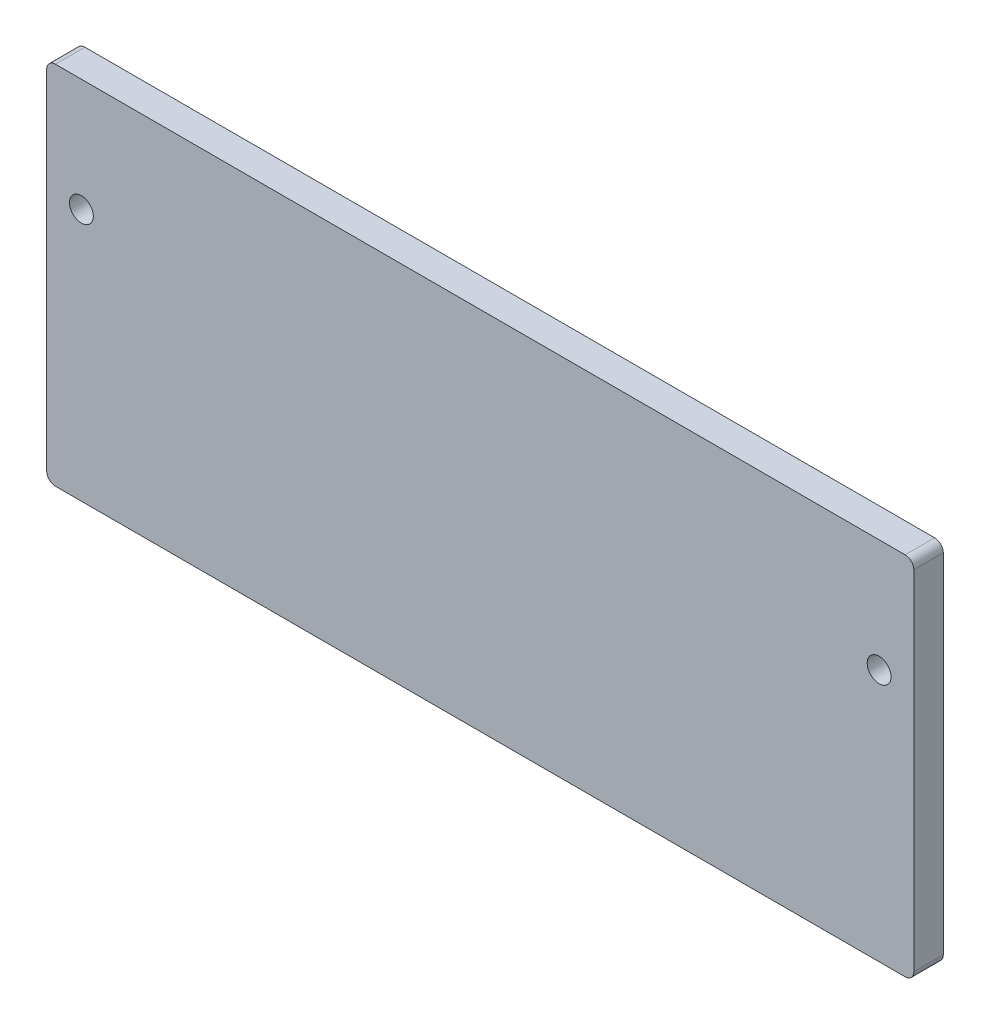
ISO-10303-21;
HEADER;
FILE_DESCRIPTION(('STEP AP214'),'2;1');
FILE_NAME('part.step','',(''),(''),'','','');
FILE_SCHEMA(('AUTOMOTIVE_DESIGN { 1 0 10303 214 1 1 1 1 }'));
ENDSEC;
DATA;
#1=APPLICATION_CONTEXT('core data for automotive mechanical design processes');
#2=APPLICATION_PROTOCOL_DEFINITION('international standard','automotive_design',2000,#1);
#3=PRODUCT_CONTEXT('',#1,'mechanical');
#4=PRODUCT('Part','Part','',(#3));
#5=PRODUCT_RELATED_PRODUCT_CATEGORY('part','',(#4));
#6=PRODUCT_DEFINITION_FORMATION('','',#4);
#7=PRODUCT_DEFINITION_CONTEXT('part definition',#1,'design');
#8=PRODUCT_DEFINITION('design','',#6,#7);
#9=PRODUCT_DEFINITION_SHAPE('','',#8);
#10=(LENGTH_UNIT() NAMED_UNIT(*) SI_UNIT(.MILLI.,.METRE.));
#11=(NAMED_UNIT(*) PLANE_ANGLE_UNIT() SI_UNIT($,.RADIAN.));
#12=(NAMED_UNIT(*) SI_UNIT($,.STERADIAN.) SOLID_ANGLE_UNIT());
#13=UNCERTAINTY_MEASURE_WITH_UNIT(LENGTH_MEASURE(1.E-05),#10,'distance_accuracy_value','');
#14=(GEOMETRIC_REPRESENTATION_CONTEXT(3) GLOBAL_UNCERTAINTY_ASSIGNED_CONTEXT((#13)) GLOBAL_UNIT_ASSIGNED_CONTEXT((#10,
#11,#12)) REPRESENTATION_CONTEXT('',''));
#15=CARTESIAN_POINT('',(0.,0.,0.));
#16=DIRECTION('',(0.,0.,1.));
#17=DIRECTION('',(1.,0.,0.));
#18=AXIS2_PLACEMENT_3D('',#15,#16,#17);
#19=CARTESIAN_POINT('',(-100.,-42.15,6.8));
#20=DIRECTION('',(1.,0.,0.));
#21=DIRECTION('',(0.,0.,-1.));
#22=AXIS2_PLACEMENT_3D('',#19,#20,#21);
#23=PLANE('',#22);
#24=DIRECTION('',(0.,-1.,0.));
#25=VECTOR('',#24,1.);
#26=CARTESIAN_POINT('',(-100.,-42.15,0.));
#27=LINE('',#26,#25);
#28=CARTESIAN_POINT('',(-100.,40.15,0.));
#29=VERTEX_POINT('',#28);
#30=CARTESIAN_POINT('',(-100.,-40.15,0.));
#31=VERTEX_POINT('',#30);
#32=EDGE_CURVE('E158',#29,#31,#27,.T.);
#33=ORIENTED_EDGE('',*,*,#32,.T.);
#34=DIRECTION('',(0.,0.,-1.));
#35=VECTOR('',#34,1.);
#36=CARTESIAN_POINT('',(-100.,-40.15,6.8));
#37=LINE('',#36,#35);
#38=CARTESIAN_POINT('',(-100.,-40.15,6.8));
#39=VERTEX_POINT('',#38);
#40=EDGE_CURVE('E11',#31,#39,#37,.F.);
#41=ORIENTED_EDGE('',*,*,#40,.T.);
#42=DIRECTION('',(0.,-1.,0.));
#43=VECTOR('',#42,1.);
#44=CARTESIAN_POINT('',(-100.,-42.15,6.8));
#45=LINE('',#44,#43);
#46=CARTESIAN_POINT('',(-100.,40.15,6.8));
#47=VERTEX_POINT('',#46);
#48=EDGE_CURVE('E126',#47,#39,#45,.T.);
#49=ORIENTED_EDGE('',*,*,#48,.F.);
#50=DIRECTION('',(0.,0.,-1.));
#51=VECTOR('',#50,1.);
#52=CARTESIAN_POINT('',(-100.,40.15,6.8));
#53=LINE('',#52,#51);
#54=EDGE_CURVE('E42',#47,#29,#53,.T.);
#55=ORIENTED_EDGE('',*,*,#54,.T.);
#56=EDGE_LOOP('',(#33,#41,#49,#55));
#57=FACE_BOUND('',#56,.T.);
#58=ADVANCED_FACE('F34',(#57),#23,.F.);
#59=CARTESIAN_POINT('',(100.,-42.15,6.8));
#60=DIRECTION('',(0.,1.,0.));
#61=DIRECTION('',(-1.,0.,0.));
#62=AXIS2_PLACEMENT_3D('',#59,#60,#61);
#63=PLANE('',#62);
#64=DIRECTION('',(1.,0.,0.));
#65=VECTOR('',#64,1.);
#66=CARTESIAN_POINT('',(100.,-42.15,0.));
#67=LINE('',#66,#65);
#68=CARTESIAN_POINT('',(-98.,-42.15,0.));
#69=VERTEX_POINT('',#68);
#70=CARTESIAN_POINT('',(98.,-42.15,0.));
#71=VERTEX_POINT('',#70);
#72=EDGE_CURVE('E131',#69,#71,#67,.T.);
#73=ORIENTED_EDGE('',*,*,#72,.T.);
#74=DIRECTION('',(0.,0.,-1.));
#75=VECTOR('',#74,1.);
#76=CARTESIAN_POINT('',(98.,-42.15,6.8));
#77=LINE('',#76,#75);
#78=CARTESIAN_POINT('',(98.,-42.15,6.8));
#79=VERTEX_POINT('',#78);
#80=EDGE_CURVE('E49',#71,#79,#77,.F.);
#81=ORIENTED_EDGE('',*,*,#80,.T.);
#82=DIRECTION('',(1.,0.,0.));
#83=VECTOR('',#82,1.);
#84=CARTESIAN_POINT('',(100.,-42.15,6.8));
#85=LINE('',#84,#83);
#86=CARTESIAN_POINT('',(-98.,-42.15,6.8));
#87=VERTEX_POINT('',#86);
#88=EDGE_CURVE('E129',#87,#79,#85,.T.);
#89=ORIENTED_EDGE('',*,*,#88,.F.);
#90=DIRECTION('',(0.,0.,-1.));
#91=VECTOR('',#90,1.);
#92=CARTESIAN_POINT('',(-98.,-42.15,6.8));
#93=LINE('',#92,#91);
#94=EDGE_CURVE('E150',#87,#69,#93,.T.);
#95=ORIENTED_EDGE('',*,*,#94,.T.);
#96=EDGE_LOOP('',(#73,#81,#89,#95));
#97=FACE_BOUND('',#96,.T.);
#98=ADVANCED_FACE('F204',(#97),#63,.F.);
#99=CARTESIAN_POINT('',(100.,-42.15,6.8));
#100=DIRECTION('',(-1.,0.,0.));
#101=DIRECTION('',(0.,0.,1.));
#102=AXIS2_PLACEMENT_3D('',#99,#100,#101);
#103=PLANE('',#102);
#104=DIRECTION('',(0.,1.,0.));
#105=VECTOR('',#104,1.);
#106=CARTESIAN_POINT('',(100.,-42.15,0.));
#107=LINE('',#106,#105);
#108=CARTESIAN_POINT('',(100.,-40.15,0.));
#109=VERTEX_POINT('',#108);
#110=CARTESIAN_POINT('',(100.,40.15,0.));
#111=VERTEX_POINT('',#110);
#112=EDGE_CURVE('E127',#109,#111,#107,.T.);
#113=ORIENTED_EDGE('',*,*,#112,.T.);
#114=DIRECTION('',(0.,0.,-1.));
#115=VECTOR('',#114,1.);
#116=CARTESIAN_POINT('',(100.,40.15,6.8));
#117=LINE('',#116,#115);
#118=CARTESIAN_POINT('',(100.,40.15,6.8));
#119=VERTEX_POINT('',#118);
#120=EDGE_CURVE('E105',#111,#119,#117,.F.);
#121=ORIENTED_EDGE('',*,*,#120,.T.);
#122=DIRECTION('',(0.,1.,0.));
#123=VECTOR('',#122,1.);
#124=CARTESIAN_POINT('',(100.,-42.15,6.8));
#125=LINE('',#124,#123);
#126=CARTESIAN_POINT('',(100.,-40.15,6.8));
#127=VERTEX_POINT('',#126);
#128=EDGE_CURVE('E170',#127,#119,#125,.T.);
#129=ORIENTED_EDGE('',*,*,#128,.F.);
#130=DIRECTION('',(0.,0.,-1.));
#131=VECTOR('',#130,1.);
#132=CARTESIAN_POINT('',(100.,-40.15,6.8));
#133=LINE('',#132,#131);
#134=EDGE_CURVE('E110',#127,#109,#133,.T.);
#135=ORIENTED_EDGE('',*,*,#134,.T.);
#136=EDGE_LOOP('',(#113,#121,#129,#135));
#137=FACE_BOUND('',#136,.T.);
#138=ADVANCED_FACE('F201',(#137),#103,.F.);
#139=CARTESIAN_POINT('',(100.,42.15,6.8));
#140=DIRECTION('',(0.,-1.,0.));
#141=DIRECTION('',(1.,0.,0.));
#142=AXIS2_PLACEMENT_3D('',#139,#140,#141);
#143=PLANE('',#142);
#144=DIRECTION('',(-1.,0.,0.));
#145=VECTOR('',#144,1.);
#146=CARTESIAN_POINT('',(100.,42.15,6.8));
#147=LINE('',#146,#145);
#148=CARTESIAN_POINT('',(98.,42.15,6.8));
#149=VERTEX_POINT('',#148);
#150=CARTESIAN_POINT('',(-98.,42.15,6.8));
#151=VERTEX_POINT('',#150);
#152=EDGE_CURVE('E120',#149,#151,#147,.T.);
#153=ORIENTED_EDGE('',*,*,#152,.F.);
#154=DIRECTION('',(0.,0.,-1.));
#155=VECTOR('',#154,1.);
#156=CARTESIAN_POINT('',(98.,42.15,6.8));
#157=LINE('',#156,#155);
#158=CARTESIAN_POINT('',(98.,42.15,0.));
#159=VERTEX_POINT('',#158);
#160=EDGE_CURVE('E104',#149,#159,#157,.T.);
#161=ORIENTED_EDGE('',*,*,#160,.T.);
#162=DIRECTION('',(-1.,0.,0.));
#163=VECTOR('',#162,1.);
#164=CARTESIAN_POINT('',(100.,42.15,0.));
#165=LINE('',#164,#163);
#166=CARTESIAN_POINT('',(-98.,42.15,0.));
#167=VERTEX_POINT('',#166);
#168=EDGE_CURVE('E117',#159,#167,#165,.T.);
#169=ORIENTED_EDGE('',*,*,#168,.T.);
#170=DIRECTION('',(0.,0.,-1.));
#171=VECTOR('',#170,1.);
#172=CARTESIAN_POINT('',(-98.,42.15,6.8));
#173=LINE('',#172,#171);
#174=EDGE_CURVE('E122',#167,#151,#173,.F.);
#175=ORIENTED_EDGE('',*,*,#174,.T.);
#176=EDGE_LOOP('',(#153,#161,#169,#175));
#177=FACE_BOUND('',#176,.T.);
#178=ADVANCED_FACE('F116',(#177),#143,.F.);
#179=CARTESIAN_POINT('',(0.,0.,6.8));
#180=DIRECTION('',(0.,0.,1.));
#181=DIRECTION('',(1.,0.,0.));
#182=AXIS2_PLACEMENT_3D('',#179,#180,#181);
#183=PLANE('',#182);
#184=CARTESIAN_POINT('',(92.,16.15,6.8));
#185=DIRECTION('',(0.,0.,1.));
#186=DIRECTION('',(1.,0.,0.));
#187=AXIS2_PLACEMENT_3D('',#184,#185,#186);
#188=CIRCLE('',#187,2.75000000000001);
#189=CARTESIAN_POINT('',(94.75,16.15,6.8));
#190=VERTEX_POINT('',#189);
#191=EDGE_CURVE('E177',#190,#190,#188,.T.);
#192=ORIENTED_EDGE('',*,*,#191,.F.);
#193=EDGE_LOOP('',(#192));
#194=FACE_BOUND('',#193,.T.);
#195=CARTESIAN_POINT('',(-92.,16.15,6.8));
#196=DIRECTION('',(0.,0.,1.));
#197=DIRECTION('',(1.,0.,0.));
#198=AXIS2_PLACEMENT_3D('',#195,#196,#197);
#199=CIRCLE('',#198,2.75000000000001);
#200=CARTESIAN_POINT('',(-89.25,16.15,6.8));
#201=VERTEX_POINT('',#200);
#202=EDGE_CURVE('E166',#201,#201,#199,.T.);
#203=ORIENTED_EDGE('',*,*,#202,.F.);
#204=EDGE_LOOP('',(#203));
#205=FACE_BOUND('',#204,.T.);
#206=ORIENTED_EDGE('',*,*,#128,.T.);
#207=CARTESIAN_POINT('',(98.,40.15,6.8));
#208=DIRECTION('',(0.,0.,1.));
#209=DIRECTION('',(1.,0.,0.));
#210=AXIS2_PLACEMENT_3D('',#207,#208,#209);
#211=CIRCLE('',#210,2.);
#212=EDGE_CURVE('E148',#119,#149,#211,.T.);
#213=ORIENTED_EDGE('',*,*,#212,.T.);
#214=ORIENTED_EDGE('',*,*,#152,.T.);
#215=CARTESIAN_POINT('',(-98.,40.15,6.8));
#216=DIRECTION('',(0.,0.,1.));
#217=DIRECTION('',(1.,0.,0.));
#218=AXIS2_PLACEMENT_3D('',#215,#216,#217);
#219=CIRCLE('',#218,2.);
#220=EDGE_CURVE('E143',#151,#47,#219,.T.);
#221=ORIENTED_EDGE('',*,*,#220,.T.);
#222=ORIENTED_EDGE('',*,*,#48,.T.);
#223=CARTESIAN_POINT('',(-98.,-40.15,6.8));
#224=DIRECTION('',(0.,0.,1.));
#225=DIRECTION('',(1.,0.,0.));
#226=AXIS2_PLACEMENT_3D('',#223,#224,#225);
#227=CIRCLE('',#226,2.);
#228=EDGE_CURVE('E56',#39,#87,#227,.T.);
#229=ORIENTED_EDGE('',*,*,#228,.T.);
#230=ORIENTED_EDGE('',*,*,#88,.T.);
#231=CARTESIAN_POINT('',(98.,-40.15,6.8));
#232=DIRECTION('',(0.,0.,1.));
#233=DIRECTION('',(1.,0.,0.));
#234=AXIS2_PLACEMENT_3D('',#231,#232,#233);
#235=CIRCLE('',#234,2.);
#236=EDGE_CURVE('E146',#79,#127,#235,.T.);
#237=ORIENTED_EDGE('',*,*,#236,.T.);
#238=EDGE_LOOP('',(#206,#213,#214,#221,#222,#229,#230,#237));
#239=FACE_BOUND('',#238,.T.);
#240=ADVANCED_FACE('F192',(#194,#205,#239),#183,.T.);
#241=CARTESIAN_POINT('',(0.,0.,0.));
#242=DIRECTION('',(0.,0.,1.));
#243=DIRECTION('',(1.,0.,0.));
#244=AXIS2_PLACEMENT_3D('',#241,#242,#243);
#245=PLANE('',#244);
#246=CARTESIAN_POINT('',(92.,16.15,0.));
#247=DIRECTION('',(0.,0.,1.));
#248=DIRECTION('',(1.,0.,0.));
#249=AXIS2_PLACEMENT_3D('',#246,#247,#248);
#250=CIRCLE('',#249,2.75000000000001);
#251=CARTESIAN_POINT('',(94.75,16.15,0.));
#252=VERTEX_POINT('',#251);
#253=EDGE_CURVE('E175',#252,#252,#250,.T.);
#254=ORIENTED_EDGE('',*,*,#253,.T.);
#255=EDGE_LOOP('',(#254));
#256=FACE_BOUND('',#255,.T.);
#257=CARTESIAN_POINT('',(-92.,16.15,0.));
#258=DIRECTION('',(0.,0.,1.));
#259=DIRECTION('',(1.,0.,0.));
#260=AXIS2_PLACEMENT_3D('',#257,#258,#259);
#261=CIRCLE('',#260,2.75000000000001);
#262=CARTESIAN_POINT('',(-89.25,16.15,0.));
#263=VERTEX_POINT('',#262);
#264=EDGE_CURVE('E163',#263,#263,#261,.T.);
#265=ORIENTED_EDGE('',*,*,#264,.T.);
#266=EDGE_LOOP('',(#265));
#267=FACE_BOUND('',#266,.T.);
#268=ORIENTED_EDGE('',*,*,#168,.F.);
#269=CARTESIAN_POINT('',(98.,40.15,0.));
#270=DIRECTION('',(0.,0.,1.));
#271=DIRECTION('',(1.,0.,0.));
#272=AXIS2_PLACEMENT_3D('',#269,#270,#271);
#273=CIRCLE('',#272,2.);
#274=EDGE_CURVE('E100',#159,#111,#273,.F.);
#275=ORIENTED_EDGE('',*,*,#274,.T.);
#276=ORIENTED_EDGE('',*,*,#112,.F.);
#277=CARTESIAN_POINT('',(98.,-40.15,0.));
#278=DIRECTION('',(0.,0.,1.));
#279=DIRECTION('',(1.,0.,0.));
#280=AXIS2_PLACEMENT_3D('',#277,#278,#279);
#281=CIRCLE('',#280,2.);
#282=EDGE_CURVE('E111',#109,#71,#281,.F.);
#283=ORIENTED_EDGE('',*,*,#282,.T.);
#284=ORIENTED_EDGE('',*,*,#72,.F.);
#285=CARTESIAN_POINT('',(-98.,-40.15,0.));
#286=DIRECTION('',(0.,0.,1.));
#287=DIRECTION('',(1.,0.,0.));
#288=AXIS2_PLACEMENT_3D('',#285,#286,#287);
#289=CIRCLE('',#288,2.);
#290=EDGE_CURVE('E137',#69,#31,#289,.F.);
#291=ORIENTED_EDGE('',*,*,#290,.T.);
#292=ORIENTED_EDGE('',*,*,#32,.F.);
#293=CARTESIAN_POINT('',(-98.,40.15,0.));
#294=DIRECTION('',(0.,0.,1.));
#295=DIRECTION('',(1.,0.,0.));
#296=AXIS2_PLACEMENT_3D('',#293,#294,#295);
#297=CIRCLE('',#296,2.);
#298=EDGE_CURVE('E121',#29,#167,#297,.F.);
#299=ORIENTED_EDGE('',*,*,#298,.T.);
#300=EDGE_LOOP('',(#268,#275,#276,#283,#284,#291,#292,#299));
#301=FACE_BOUND('',#300,.T.);
#302=ADVANCED_FACE('F124',(#256,#267,#301),#245,.F.);
#303=CARTESIAN_POINT('',(-92.,16.15,0.));
#304=DIRECTION('',(0.,0.,1.));
#305=DIRECTION('',(1.,0.,0.));
#306=AXIS2_PLACEMENT_3D('',#303,#304,#305);
#307=CYLINDRICAL_SURFACE('',#306,2.75000000000001);
#308=ORIENTED_EDGE('',*,*,#264,.F.);
#309=EDGE_LOOP('',(#308));
#310=FACE_BOUND('',#309,.T.);
#311=ORIENTED_EDGE('',*,*,#202,.T.);
#312=EDGE_LOOP('',(#311));
#313=FACE_BOUND('',#312,.T.);
#314=ADVANCED_FACE('F188',(#310,#313),#307,.F.);
#315=CARTESIAN_POINT('',(92.,16.15,0.));
#316=DIRECTION('',(0.,0.,1.));
#317=DIRECTION('',(1.,0.,0.));
#318=AXIS2_PLACEMENT_3D('',#315,#316,#317);
#319=CYLINDRICAL_SURFACE('',#318,2.75000000000001);
#320=ORIENTED_EDGE('',*,*,#253,.F.);
#321=EDGE_LOOP('',(#320));
#322=FACE_BOUND('',#321,.T.);
#323=ORIENTED_EDGE('',*,*,#191,.T.);
#324=EDGE_LOOP('',(#323));
#325=FACE_BOUND('',#324,.T.);
#326=ADVANCED_FACE('F185',(#322,#325),#319,.F.);
#327=CARTESIAN_POINT('',(98.,40.15,6.8));
#328=DIRECTION('',(0.,0.,-1.));
#329=DIRECTION('',(-1.,0.,0.));
#330=AXIS2_PLACEMENT_3D('',#327,#328,#329);
#331=CYLINDRICAL_SURFACE('',#330,2.);
#332=ORIENTED_EDGE('',*,*,#212,.F.);
#333=ORIENTED_EDGE('',*,*,#120,.F.);
#334=ORIENTED_EDGE('',*,*,#274,.F.);
#335=ORIENTED_EDGE('',*,*,#160,.F.);
#336=EDGE_LOOP('',(#332,#333,#334,#335));
#337=FACE_BOUND('',#336,.T.);
#338=ADVANCED_FACE('F103',(#337),#331,.T.);
#339=CARTESIAN_POINT('',(98.,-40.15,6.8));
#340=DIRECTION('',(0.,0.,-1.));
#341=DIRECTION('',(-1.,0.,0.));
#342=AXIS2_PLACEMENT_3D('',#339,#340,#341);
#343=CYLINDRICAL_SURFACE('',#342,2.);
#344=ORIENTED_EDGE('',*,*,#236,.F.);
#345=ORIENTED_EDGE('',*,*,#80,.F.);
#346=ORIENTED_EDGE('',*,*,#282,.F.);
#347=ORIENTED_EDGE('',*,*,#134,.F.);
#348=EDGE_LOOP('',(#344,#345,#346,#347));
#349=FACE_BOUND('',#348,.T.);
#350=ADVANCED_FACE('F203',(#349),#343,.T.);
#351=CARTESIAN_POINT('',(-98.,-40.15,6.8));
#352=DIRECTION('',(0.,0.,-1.));
#353=DIRECTION('',(-1.,0.,0.));
#354=AXIS2_PLACEMENT_3D('',#351,#352,#353);
#355=CYLINDRICAL_SURFACE('',#354,2.);
#356=ORIENTED_EDGE('',*,*,#228,.F.);
#357=ORIENTED_EDGE('',*,*,#40,.F.);
#358=ORIENTED_EDGE('',*,*,#290,.F.);
#359=ORIENTED_EDGE('',*,*,#94,.F.);
#360=EDGE_LOOP('',(#356,#357,#358,#359));
#361=FACE_BOUND('',#360,.T.);
#362=ADVANCED_FACE('F207',(#361),#355,.T.);
#363=CARTESIAN_POINT('',(-98.,40.15,6.8));
#364=DIRECTION('',(0.,0.,-1.));
#365=DIRECTION('',(-1.,0.,0.));
#366=AXIS2_PLACEMENT_3D('',#363,#364,#365);
#367=CYLINDRICAL_SURFACE('',#366,2.);
#368=ORIENTED_EDGE('',*,*,#220,.F.);
#369=ORIENTED_EDGE('',*,*,#174,.F.);
#370=ORIENTED_EDGE('',*,*,#298,.F.);
#371=ORIENTED_EDGE('',*,*,#54,.F.);
#372=EDGE_LOOP('',(#368,#369,#370,#371));
#373=FACE_BOUND('',#372,.T.);
#374=ADVANCED_FACE('F36',(#373),#367,.T.);
#375=CLOSED_SHELL('',(#58,#98,#138,#178,#240,#302,#314,#326,#338,#350,#362,#374));
#376=MANIFOLD_SOLID_BREP('B2',#375);
#377=ADVANCED_BREP_SHAPE_REPRESENTATION('',(#18,#376),#14);
#378=SHAPE_DEFINITION_REPRESENTATION(#9,#377);
ENDSEC;
END-ISO-10303-21;
